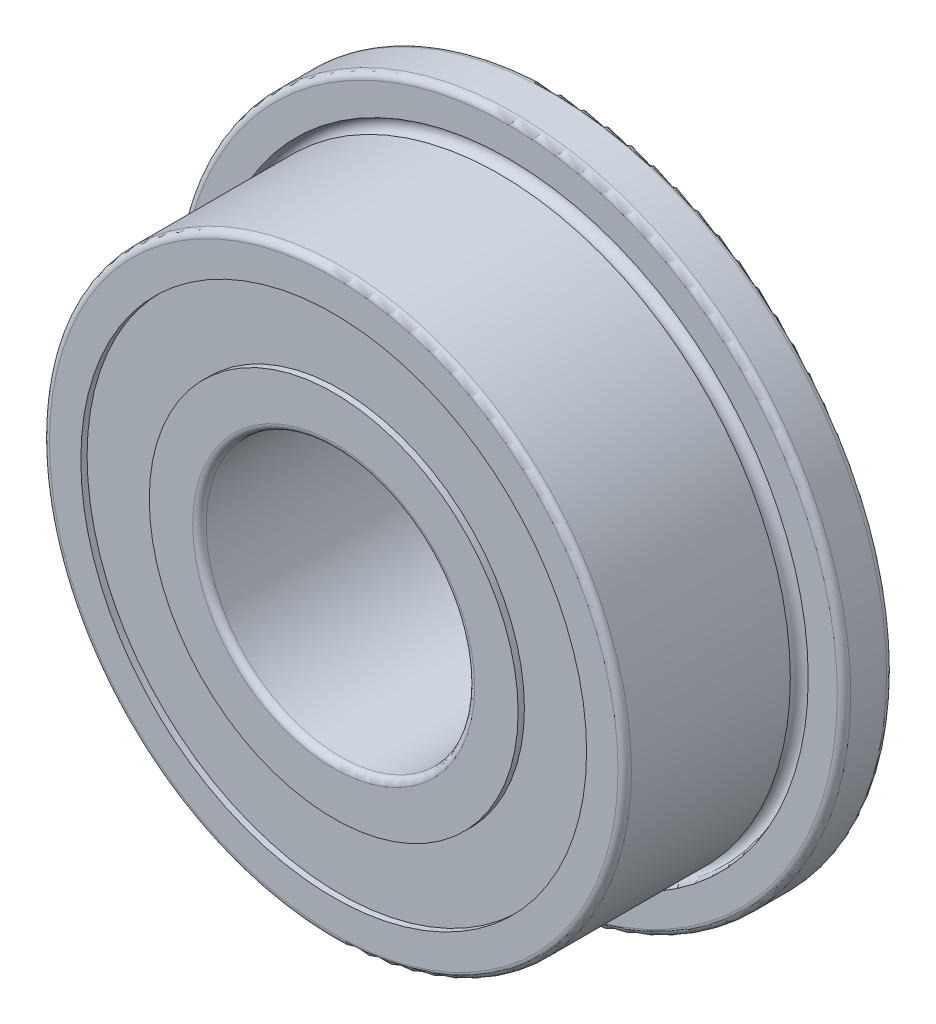
ISO-10303-21;
HEADER;
FILE_DESCRIPTION(('STEP AP214'),'2;1');
FILE_NAME('part.step','',(''),(''),'','','');
FILE_SCHEMA(('AUTOMOTIVE_DESIGN { 1 0 10303 214 1 1 1 1 }'));
ENDSEC;
DATA;
#1=APPLICATION_CONTEXT('core data for automotive mechanical design processes');
#2=APPLICATION_PROTOCOL_DEFINITION('international standard','automotive_design',2000,#1);
#3=PRODUCT_CONTEXT('',#1,'mechanical');
#4=PRODUCT('Part','Part','',(#3));
#5=PRODUCT_RELATED_PRODUCT_CATEGORY('part','',(#4));
#6=PRODUCT_DEFINITION_FORMATION('','',#4);
#7=PRODUCT_DEFINITION_CONTEXT('part definition',#1,'design');
#8=PRODUCT_DEFINITION('design','',#6,#7);
#9=PRODUCT_DEFINITION_SHAPE('','',#8);
#10=(LENGTH_UNIT() NAMED_UNIT(*) SI_UNIT(.MILLI.,.METRE.));
#11=(NAMED_UNIT(*) PLANE_ANGLE_UNIT() SI_UNIT($,.RADIAN.));
#12=(NAMED_UNIT(*) SI_UNIT($,.STERADIAN.) SOLID_ANGLE_UNIT());
#13=UNCERTAINTY_MEASURE_WITH_UNIT(LENGTH_MEASURE(1.E-05),#10,'distance_accuracy_value','');
#14=(GEOMETRIC_REPRESENTATION_CONTEXT(3) GLOBAL_UNCERTAINTY_ASSIGNED_CONTEXT((#13)) GLOBAL_UNIT_ASSIGNED_CONTEXT((#10,
#11,#12)) REPRESENTATION_CONTEXT('',''));
#15=CARTESIAN_POINT('',(0.,0.,0.));
#16=DIRECTION('',(0.,0.,1.));
#17=DIRECTION('',(1.,0.,0.));
#18=AXIS2_PLACEMENT_3D('',#15,#16,#17);
#19=CARTESIAN_POINT('',(0.,0.,-0.149999999999969));
#20=DIRECTION('',(0.,0.,1.));
#21=DIRECTION('',(1.,0.,0.));
#22=AXIS2_PLACEMENT_3D('',#19,#20,#21);
#23=TOROIDAL_SURFACE('',#22,6.35000000000003,0.149999999999969);
#24=CARTESIAN_POINT('',(0.,0.,0.));
#25=DIRECTION('',(0.,0.,1.));
#26=DIRECTION('',(1.,0.,0.));
#27=AXIS2_PLACEMENT_3D('',#24,#25,#26);
#28=CIRCLE('',#27,6.35);
#29=CARTESIAN_POINT('',(6.35,0.,0.));
#30=VERTEX_POINT('',#29);
#31=EDGE_CURVE('E10',#30,#30,#28,.T.);
#32=ORIENTED_EDGE('',*,*,#31,.F.);
#33=EDGE_LOOP('',(#32));
#34=FACE_BOUND('',#33,.T.);
#35=CARTESIAN_POINT('',(0.,0.,-0.15));
#36=DIRECTION('',(0.,0.,1.));
#37=DIRECTION('',(1.,0.,0.));
#38=AXIS2_PLACEMENT_3D('',#35,#36,#37);
#39=CIRCLE('',#38,6.5);
#40=CARTESIAN_POINT('',(6.5,0.,-0.15));
#41=VERTEX_POINT('',#40);
#42=EDGE_CURVE('E94',#41,#41,#39,.T.);
#43=ORIENTED_EDGE('',*,*,#42,.T.);
#44=EDGE_LOOP('',(#43));
#45=FACE_BOUND('',#44,.T.);
#46=ADVANCED_FACE('F30',(#34,#45),#23,.T.);
#47=CARTESIAN_POINT('',(0.,6.35,0.));
#48=DIRECTION('',(0.,0.,-1.));
#49=DIRECTION('',(-1.,0.,0.));
#50=AXIS2_PLACEMENT_3D('',#47,#48,#49);
#51=PLANE('',#50);
#52=CARTESIAN_POINT('',(0.,0.,0.));
#53=DIRECTION('',(0.,0.,1.));
#54=DIRECTION('',(1.,0.,0.));
#55=AXIS2_PLACEMENT_3D('',#52,#53,#54);
#56=CIRCLE('',#55,5.649);
#57=CARTESIAN_POINT('',(5.649,0.,0.));
#58=VERTEX_POINT('',#57);
#59=EDGE_CURVE('E36',#58,#58,#56,.T.);
#60=ORIENTED_EDGE('',*,*,#59,.F.);
#61=EDGE_LOOP('',(#60));
#62=FACE_BOUND('',#61,.T.);
#63=ORIENTED_EDGE('',*,*,#31,.T.);
#64=EDGE_LOOP('',(#63));
#65=FACE_BOUND('',#64,.T.);
#66=ADVANCED_FACE('F203',(#62,#65),#51,.F.);
#67=CARTESIAN_POINT('',(0.,0.,-5.));
#68=DIRECTION('',(0.,0.,1.));
#69=DIRECTION('',(1.,0.,0.));
#70=AXIS2_PLACEMENT_3D('',#67,#68,#69);
#71=CYLINDRICAL_SURFACE('',#70,5.649);
#72=CARTESIAN_POINT('',(0.,0.,-0.14));
#73=DIRECTION('',(0.,0.,1.));
#74=DIRECTION('',(1.,0.,0.));
#75=AXIS2_PLACEMENT_3D('',#72,#73,#74);
#76=CIRCLE('',#75,5.649);
#77=CARTESIAN_POINT('',(5.649,0.,-0.14));
#78=VERTEX_POINT('',#77);
#79=EDGE_CURVE('E40',#78,#78,#76,.T.);
#80=ORIENTED_EDGE('',*,*,#79,.F.);
#81=EDGE_LOOP('',(#80));
#82=FACE_BOUND('',#81,.T.);
#83=ORIENTED_EDGE('',*,*,#59,.T.);
#84=EDGE_LOOP('',(#83));
#85=FACE_BOUND('',#84,.T.);
#86=ADVANCED_FACE('F198',(#82,#85),#71,.F.);
#87=CARTESIAN_POINT('',(0.,5.649,-0.14));
#88=DIRECTION('',(0.,0.,-1.));
#89=DIRECTION('',(-1.,0.,0.));
#90=AXIS2_PLACEMENT_3D('',#87,#88,#89);
#91=PLANE('',#90);
#92=CARTESIAN_POINT('',(0.,0.,-0.14));
#93=DIRECTION('',(0.,0.,1.));
#94=DIRECTION('',(1.,0.,0.));
#95=AXIS2_PLACEMENT_3D('',#92,#93,#94);
#96=CIRCLE('',#95,4.12);
#97=CARTESIAN_POINT('',(4.12,0.,-0.14));
#98=VERTEX_POINT('',#97);
#99=EDGE_CURVE('E44',#98,#98,#96,.T.);
#100=ORIENTED_EDGE('',*,*,#99,.F.);
#101=EDGE_LOOP('',(#100));
#102=FACE_BOUND('',#101,.T.);
#103=ORIENTED_EDGE('',*,*,#79,.T.);
#104=EDGE_LOOP('',(#103));
#105=FACE_BOUND('',#104,.T.);
#106=ADVANCED_FACE('F192',(#102,#105),#91,.F.);
#107=CARTESIAN_POINT('',(0.,0.,-5.));
#108=DIRECTION('',(0.,0.,1.));
#109=DIRECTION('',(1.,0.,0.));
#110=AXIS2_PLACEMENT_3D('',#107,#108,#109);
#111=CYLINDRICAL_SURFACE('',#110,4.12);
#112=CARTESIAN_POINT('',(0.,0.,0.));
#113=DIRECTION('',(0.,0.,1.));
#114=DIRECTION('',(1.,0.,0.));
#115=AXIS2_PLACEMENT_3D('',#112,#113,#114);
#116=CIRCLE('',#115,4.12);
#117=CARTESIAN_POINT('',(4.12,0.,0.));
#118=VERTEX_POINT('',#117);
#119=EDGE_CURVE('E49',#118,#118,#116,.T.);
#120=ORIENTED_EDGE('',*,*,#119,.F.);
#121=EDGE_LOOP('',(#120));
#122=FACE_BOUND('',#121,.T.);
#123=ORIENTED_EDGE('',*,*,#99,.T.);
#124=EDGE_LOOP('',(#123));
#125=FACE_BOUND('',#124,.T.);
#126=ADVANCED_FACE('F186',(#122,#125),#111,.T.);
#127=CARTESIAN_POINT('',(0.,4.12,0.));
#128=DIRECTION('',(0.,0.,-1.));
#129=DIRECTION('',(-1.,0.,0.));
#130=AXIS2_PLACEMENT_3D('',#127,#128,#129);
#131=PLANE('',#130);
#132=CARTESIAN_POINT('',(0.,0.,0.));
#133=DIRECTION('',(0.,0.,1.));
#134=DIRECTION('',(1.,0.,0.));
#135=AXIS2_PLACEMENT_3D('',#132,#133,#134);
#136=CIRCLE('',#135,3.15);
#137=CARTESIAN_POINT('',(3.15,0.,0.));
#138=VERTEX_POINT('',#137);
#139=EDGE_CURVE('E52',#138,#138,#136,.T.);
#140=ORIENTED_EDGE('',*,*,#139,.F.);
#141=EDGE_LOOP('',(#140));
#142=FACE_BOUND('',#141,.T.);
#143=ORIENTED_EDGE('',*,*,#119,.T.);
#144=EDGE_LOOP('',(#143));
#145=FACE_BOUND('',#144,.T.);
#146=ADVANCED_FACE('F180',(#142,#145),#131,.F.);
#147=CARTESIAN_POINT('',(0.,0.,-0.149999999999969));
#148=DIRECTION('',(0.,0.,1.));
#149=DIRECTION('',(1.,0.,0.));
#150=AXIS2_PLACEMENT_3D('',#147,#148,#149);
#151=TOROIDAL_SURFACE('',#150,3.14999999999997,0.149999999999969);
#152=CARTESIAN_POINT('',(0.,0.,-0.15));
#153=DIRECTION('',(0.,0.,1.));
#154=DIRECTION('',(1.,0.,0.));
#155=AXIS2_PLACEMENT_3D('',#152,#153,#154);
#156=CIRCLE('',#155,3.);
#157=CARTESIAN_POINT('',(3.,0.,-0.15));
#158=VERTEX_POINT('',#157);
#159=EDGE_CURVE('E55',#158,#158,#156,.T.);
#160=ORIENTED_EDGE('',*,*,#159,.F.);
#161=EDGE_LOOP('',(#160));
#162=FACE_BOUND('',#161,.T.);
#163=ORIENTED_EDGE('',*,*,#139,.T.);
#164=EDGE_LOOP('',(#163));
#165=FACE_BOUND('',#164,.T.);
#166=ADVANCED_FACE('F174',(#162,#165),#151,.T.);
#167=CARTESIAN_POINT('',(0.,0.,-5.));
#168=DIRECTION('',(0.,0.,1.));
#169=DIRECTION('',(1.,0.,0.));
#170=AXIS2_PLACEMENT_3D('',#167,#168,#169);
#171=CYLINDRICAL_SURFACE('',#170,3.);
#172=CARTESIAN_POINT('',(0.,0.,-4.85));
#173=DIRECTION('',(0.,0.,1.));
#174=DIRECTION('',(1.,0.,0.));
#175=AXIS2_PLACEMENT_3D('',#172,#173,#174);
#176=CIRCLE('',#175,3.);
#177=CARTESIAN_POINT('',(3.,0.,-4.85));
#178=VERTEX_POINT('',#177);
#179=EDGE_CURVE('E58',#178,#178,#176,.T.);
#180=ORIENTED_EDGE('',*,*,#179,.F.);
#181=EDGE_LOOP('',(#180));
#182=FACE_BOUND('',#181,.T.);
#183=ORIENTED_EDGE('',*,*,#159,.T.);
#184=EDGE_LOOP('',(#183));
#185=FACE_BOUND('',#184,.T.);
#186=ADVANCED_FACE('F168',(#182,#185),#171,.F.);
#187=CARTESIAN_POINT('',(0.,0.,-4.85000000000006));
#188=DIRECTION('',(0.,0.,1.));
#189=DIRECTION('',(1.,0.,0.));
#190=AXIS2_PLACEMENT_3D('',#187,#188,#189);
#191=TOROIDAL_SURFACE('',#190,3.14999999999994,0.149999999999939);
#192=CARTESIAN_POINT('',(0.,0.,-5.));
#193=DIRECTION('',(0.,0.,1.));
#194=DIRECTION('',(1.,0.,0.));
#195=AXIS2_PLACEMENT_3D('',#192,#193,#194);
#196=CIRCLE('',#195,3.15);
#197=CARTESIAN_POINT('',(3.15,0.,-5.));
#198=VERTEX_POINT('',#197);
#199=EDGE_CURVE('E61',#198,#198,#196,.T.);
#200=ORIENTED_EDGE('',*,*,#199,.F.);
#201=EDGE_LOOP('',(#200));
#202=FACE_BOUND('',#201,.T.);
#203=ORIENTED_EDGE('',*,*,#179,.T.);
#204=EDGE_LOOP('',(#203));
#205=FACE_BOUND('',#204,.T.);
#206=ADVANCED_FACE('F162',(#202,#205),#191,.T.);
#207=CARTESIAN_POINT('',(0.,3.15,-5.));
#208=DIRECTION('',(0.,0.,1.));
#209=DIRECTION('',(1.,0.,0.));
#210=AXIS2_PLACEMENT_3D('',#207,#208,#209);
#211=PLANE('',#210);
#212=CARTESIAN_POINT('',(0.,0.,-5.));
#213=DIRECTION('',(0.,0.,1.));
#214=DIRECTION('',(1.,0.,0.));
#215=AXIS2_PLACEMENT_3D('',#212,#213,#214);
#216=CIRCLE('',#215,4.12);
#217=CARTESIAN_POINT('',(4.12,0.,-5.));
#218=VERTEX_POINT('',#217);
#219=EDGE_CURVE('E64',#218,#218,#216,.T.);
#220=ORIENTED_EDGE('',*,*,#219,.F.);
#221=EDGE_LOOP('',(#220));
#222=FACE_BOUND('',#221,.T.);
#223=ORIENTED_EDGE('',*,*,#199,.T.);
#224=EDGE_LOOP('',(#223));
#225=FACE_BOUND('',#224,.T.);
#226=ADVANCED_FACE('F156',(#222,#225),#211,.F.);
#227=CARTESIAN_POINT('',(0.,0.,-5.));
#228=DIRECTION('',(0.,0.,1.));
#229=DIRECTION('',(1.,0.,0.));
#230=AXIS2_PLACEMENT_3D('',#227,#228,#229);
#231=CYLINDRICAL_SURFACE('',#230,4.12);
#232=CARTESIAN_POINT('',(0.,0.,-4.86));
#233=DIRECTION('',(0.,0.,1.));
#234=DIRECTION('',(1.,0.,0.));
#235=AXIS2_PLACEMENT_3D('',#232,#233,#234);
#236=CIRCLE('',#235,4.12);
#237=CARTESIAN_POINT('',(4.12,0.,-4.86));
#238=VERTEX_POINT('',#237);
#239=EDGE_CURVE('E67',#238,#238,#236,.T.);
#240=ORIENTED_EDGE('',*,*,#239,.F.);
#241=EDGE_LOOP('',(#240));
#242=FACE_BOUND('',#241,.T.);
#243=ORIENTED_EDGE('',*,*,#219,.T.);
#244=EDGE_LOOP('',(#243));
#245=FACE_BOUND('',#244,.T.);
#246=ADVANCED_FACE('F150',(#242,#245),#231,.T.);
#247=CARTESIAN_POINT('',(0.,4.12,-4.86));
#248=DIRECTION('',(0.,0.,1.));
#249=DIRECTION('',(1.,0.,0.));
#250=AXIS2_PLACEMENT_3D('',#247,#248,#249);
#251=PLANE('',#250);
#252=CARTESIAN_POINT('',(0.,0.,-4.86));
#253=DIRECTION('',(0.,0.,1.));
#254=DIRECTION('',(1.,0.,0.));
#255=AXIS2_PLACEMENT_3D('',#252,#253,#254);
#256=CIRCLE('',#255,5.649);
#257=CARTESIAN_POINT('',(5.649,0.,-4.86));
#258=VERTEX_POINT('',#257);
#259=EDGE_CURVE('E70',#258,#258,#256,.T.);
#260=ORIENTED_EDGE('',*,*,#259,.F.);
#261=EDGE_LOOP('',(#260));
#262=FACE_BOUND('',#261,.T.);
#263=ORIENTED_EDGE('',*,*,#239,.T.);
#264=EDGE_LOOP('',(#263));
#265=FACE_BOUND('',#264,.T.);
#266=ADVANCED_FACE('F144',(#262,#265),#251,.F.);
#267=CARTESIAN_POINT('',(0.,0.,-5.));
#268=DIRECTION('',(0.,0.,1.));
#269=DIRECTION('',(1.,0.,0.));
#270=AXIS2_PLACEMENT_3D('',#267,#268,#269);
#271=CYLINDRICAL_SURFACE('',#270,5.649);
#272=CARTESIAN_POINT('',(0.,0.,-5.));
#273=DIRECTION('',(0.,0.,1.));
#274=DIRECTION('',(1.,0.,0.));
#275=AXIS2_PLACEMENT_3D('',#272,#273,#274);
#276=CIRCLE('',#275,5.649);
#277=CARTESIAN_POINT('',(5.649,0.,-5.));
#278=VERTEX_POINT('',#277);
#279=EDGE_CURVE('E73',#278,#278,#276,.T.);
#280=ORIENTED_EDGE('',*,*,#279,.F.);
#281=EDGE_LOOP('',(#280));
#282=FACE_BOUND('',#281,.T.);
#283=ORIENTED_EDGE('',*,*,#259,.T.);
#284=EDGE_LOOP('',(#283));
#285=FACE_BOUND('',#284,.T.);
#286=ADVANCED_FACE('F138',(#282,#285),#271,.F.);
#287=CARTESIAN_POINT('',(0.,5.649,-5.));
#288=DIRECTION('',(0.,0.,1.));
#289=DIRECTION('',(1.,0.,0.));
#290=AXIS2_PLACEMENT_3D('',#287,#288,#289);
#291=PLANE('',#290);
#292=CARTESIAN_POINT('',(0.,0.,-5.));
#293=DIRECTION('',(0.,0.,1.));
#294=DIRECTION('',(1.,0.,0.));
#295=AXIS2_PLACEMENT_3D('',#292,#293,#294);
#296=CIRCLE('',#295,7.35);
#297=CARTESIAN_POINT('',(7.35,0.,-5.));
#298=VERTEX_POINT('',#297);
#299=EDGE_CURVE('E76',#298,#298,#296,.T.);
#300=ORIENTED_EDGE('',*,*,#299,.F.);
#301=EDGE_LOOP('',(#300));
#302=FACE_BOUND('',#301,.T.);
#303=ORIENTED_EDGE('',*,*,#279,.T.);
#304=EDGE_LOOP('',(#303));
#305=FACE_BOUND('',#304,.T.);
#306=ADVANCED_FACE('F132',(#302,#305),#291,.F.);
#307=CARTESIAN_POINT('',(0.,0.,-4.85000000000006));
#308=DIRECTION('',(0.,0.,1.));
#309=DIRECTION('',(1.,0.,0.));
#310=AXIS2_PLACEMENT_3D('',#307,#308,#309);
#311=TOROIDAL_SURFACE('',#310,7.35000000000006,0.149999999999938);
#312=CARTESIAN_POINT('',(0.,0.,-4.85));
#313=DIRECTION('',(0.,0.,1.));
#314=DIRECTION('',(1.,0.,0.));
#315=AXIS2_PLACEMENT_3D('',#312,#313,#314);
#316=CIRCLE('',#315,7.5);
#317=CARTESIAN_POINT('',(7.5,0.,-4.85));
#318=VERTEX_POINT('',#317);
#319=EDGE_CURVE('E79',#318,#318,#316,.T.);
#320=ORIENTED_EDGE('',*,*,#319,.F.);
#321=EDGE_LOOP('',(#320));
#322=FACE_BOUND('',#321,.T.);
#323=ORIENTED_EDGE('',*,*,#299,.T.);
#324=EDGE_LOOP('',(#323));
#325=FACE_BOUND('',#324,.T.);
#326=ADVANCED_FACE('F126',(#322,#325),#311,.T.);
#327=CARTESIAN_POINT('',(0.,0.,-5.));
#328=DIRECTION('',(0.,0.,1.));
#329=DIRECTION('',(1.,0.,0.));
#330=AXIS2_PLACEMENT_3D('',#327,#328,#329);
#331=CYLINDRICAL_SURFACE('',#330,7.5);
#332=CARTESIAN_POINT('',(0.,0.,-4.05));
#333=DIRECTION('',(0.,0.,1.));
#334=DIRECTION('',(1.,0.,0.));
#335=AXIS2_PLACEMENT_3D('',#332,#333,#334);
#336=CIRCLE('',#335,7.5);
#337=CARTESIAN_POINT('',(7.5,0.,-4.05));
#338=VERTEX_POINT('',#337);
#339=EDGE_CURVE('E82',#338,#338,#336,.T.);
#340=ORIENTED_EDGE('',*,*,#339,.F.);
#341=EDGE_LOOP('',(#340));
#342=FACE_BOUND('',#341,.T.);
#343=ORIENTED_EDGE('',*,*,#319,.T.);
#344=EDGE_LOOP('',(#343));
#345=FACE_BOUND('',#344,.T.);
#346=ADVANCED_FACE('F120',(#342,#345),#331,.T.);
#347=CARTESIAN_POINT('',(0.,0.,-4.04999999999994));
#348=DIRECTION('',(0.,0.,1.));
#349=DIRECTION('',(1.,0.,0.));
#350=AXIS2_PLACEMENT_3D('',#347,#348,#349);
#351=TOROIDAL_SURFACE('',#350,7.35000000000006,0.149999999999938);
#352=CARTESIAN_POINT('',(0.,0.,-3.9));
#353=DIRECTION('',(0.,0.,1.));
#354=DIRECTION('',(1.,0.,0.));
#355=AXIS2_PLACEMENT_3D('',#352,#353,#354);
#356=CIRCLE('',#355,7.35);
#357=CARTESIAN_POINT('',(7.35,0.,-3.9));
#358=VERTEX_POINT('',#357);
#359=EDGE_CURVE('E85',#358,#358,#356,.T.);
#360=ORIENTED_EDGE('',*,*,#359,.F.);
#361=EDGE_LOOP('',(#360));
#362=FACE_BOUND('',#361,.T.);
#363=ORIENTED_EDGE('',*,*,#339,.T.);
#364=EDGE_LOOP('',(#363));
#365=FACE_BOUND('',#364,.T.);
#366=ADVANCED_FACE('F114',(#362,#365),#351,.T.);
#367=CARTESIAN_POINT('',(0.,7.35,-3.9));
#368=DIRECTION('',(0.,0.,-1.));
#369=DIRECTION('',(-1.,0.,0.));
#370=AXIS2_PLACEMENT_3D('',#367,#368,#369);
#371=PLANE('',#370);
#372=CARTESIAN_POINT('',(0.,0.,-3.9));
#373=DIRECTION('',(0.,0.,1.));
#374=DIRECTION('',(1.,0.,0.));
#375=AXIS2_PLACEMENT_3D('',#372,#373,#374);
#376=CIRCLE('',#375,6.7);
#377=CARTESIAN_POINT('',(6.7,0.,-3.9));
#378=VERTEX_POINT('',#377);
#379=EDGE_CURVE('E88',#378,#378,#376,.T.);
#380=ORIENTED_EDGE('',*,*,#379,.F.);
#381=EDGE_LOOP('',(#380));
#382=FACE_BOUND('',#381,.T.);
#383=ORIENTED_EDGE('',*,*,#359,.T.);
#384=EDGE_LOOP('',(#383));
#385=FACE_BOUND('',#384,.T.);
#386=ADVANCED_FACE('F108',(#382,#385),#371,.F.);
#387=CARTESIAN_POINT('',(0.,0.,-3.89999999999999));
#388=DIRECTION('',(0.,0.,1.));
#389=DIRECTION('',(1.,0.,0.));
#390=AXIS2_PLACEMENT_3D('',#387,#388,#389);
#391=TOROIDAL_SURFACE('',#390,6.50000000000001,0.199999999999994);
#392=CARTESIAN_POINT('',(0.,0.,-3.7));
#393=DIRECTION('',(0.,0.,1.));
#394=DIRECTION('',(1.,0.,0.));
#395=AXIS2_PLACEMENT_3D('',#392,#393,#394);
#396=CIRCLE('',#395,6.5);
#397=CARTESIAN_POINT('',(6.5,0.,-3.7));
#398=VERTEX_POINT('',#397);
#399=EDGE_CURVE('E91',#398,#398,#396,.T.);
#400=ORIENTED_EDGE('',*,*,#399,.F.);
#401=EDGE_LOOP('',(#400));
#402=FACE_BOUND('',#401,.T.);
#403=ORIENTED_EDGE('',*,*,#379,.T.);
#404=EDGE_LOOP('',(#403));
#405=FACE_BOUND('',#404,.T.);
#406=ADVANCED_FACE('F102',(#402,#405),#391,.F.);
#407=CARTESIAN_POINT('',(0.,0.,-5.));
#408=DIRECTION('',(0.,0.,1.));
#409=DIRECTION('',(1.,0.,0.));
#410=AXIS2_PLACEMENT_3D('',#407,#408,#409);
#411=CYLINDRICAL_SURFACE('',#410,6.5);
#412=ORIENTED_EDGE('',*,*,#42,.F.);
#413=EDGE_LOOP('',(#412));
#414=FACE_BOUND('',#413,.T.);
#415=ORIENTED_EDGE('',*,*,#399,.T.);
#416=EDGE_LOOP('',(#415));
#417=FACE_BOUND('',#416,.T.);
#418=ADVANCED_FACE('F99',(#414,#417),#411,.T.);
#419=CLOSED_SHELL('',(#46,#66,#86,#106,#126,#146,#166,#186,#206,#226,#246,#266,#286,#306,#326,
#346,#366,#386,#406,#418));
#420=MANIFOLD_SOLID_BREP('B2',#419);
#421=ADVANCED_BREP_SHAPE_REPRESENTATION('',(#18,#420),#14);
#422=SHAPE_DEFINITION_REPRESENTATION(#9,#421);
ENDSEC;
END-ISO-10303-21;
